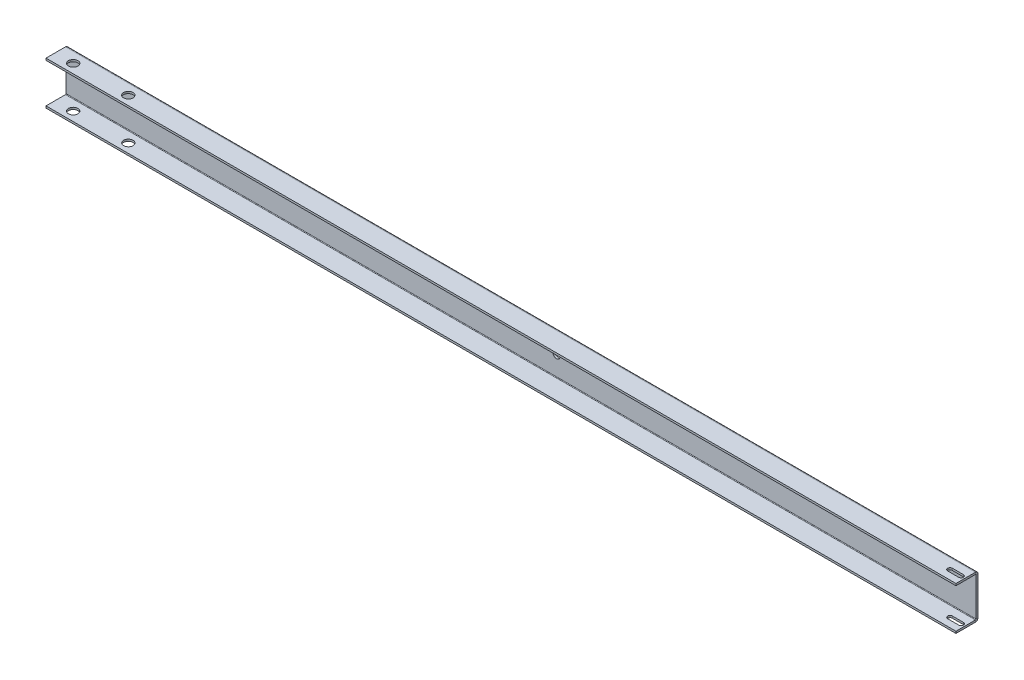
ISO-10303-21;
HEADER;
FILE_DESCRIPTION(('STEP AP214'),'2;1');
FILE_NAME('part.step','',(''),(''),'','','');
FILE_SCHEMA(('AUTOMOTIVE_DESIGN { 1 0 10303 214 1 1 1 1 }'));
ENDSEC;
DATA;
#1=APPLICATION_CONTEXT('core data for automotive mechanical design processes');
#2=APPLICATION_PROTOCOL_DEFINITION('international standard','automotive_design',2000,#1);
#3=PRODUCT_CONTEXT('',#1,'mechanical');
#4=PRODUCT('Part','Part','',(#3));
#5=PRODUCT_RELATED_PRODUCT_CATEGORY('part','',(#4));
#6=PRODUCT_DEFINITION_FORMATION('','',#4);
#7=PRODUCT_DEFINITION_CONTEXT('part definition',#1,'design');
#8=PRODUCT_DEFINITION('design','',#6,#7);
#9=PRODUCT_DEFINITION_SHAPE('','',#8);
#10=(LENGTH_UNIT() NAMED_UNIT(*) SI_UNIT(.MILLI.,.METRE.));
#11=(NAMED_UNIT(*) PLANE_ANGLE_UNIT() SI_UNIT($,.RADIAN.));
#12=(NAMED_UNIT(*) SI_UNIT($,.STERADIAN.) SOLID_ANGLE_UNIT());
#13=UNCERTAINTY_MEASURE_WITH_UNIT(LENGTH_MEASURE(1.E-05),#10,'distance_accuracy_value','');
#14=(GEOMETRIC_REPRESENTATION_CONTEXT(3) GLOBAL_UNCERTAINTY_ASSIGNED_CONTEXT((#13)) GLOBAL_UNIT_ASSIGNED_CONTEXT((#10,
#11,#12)) REPRESENTATION_CONTEXT('',''));
#15=CARTESIAN_POINT('',(0.,0.,0.));
#16=DIRECTION('',(0.,0.,1.));
#17=DIRECTION('',(1.,0.,0.));
#18=AXIS2_PLACEMENT_3D('',#15,#16,#17);
#19=CARTESIAN_POINT('',(0.,0.,-2.5));
#20=DIRECTION('',(0.,0.,-1.));
#21=DIRECTION('',(-1.,0.,0.));
#22=AXIS2_PLACEMENT_3D('',#19,#20,#21);
#23=PLANE('',#22);
#24=CARTESIAN_POINT('',(44.9385000000003,0.,-2.5));
#25=DIRECTION('',(0.,0.,-1.));
#26=DIRECTION('',(-1.,0.,0.));
#27=AXIS2_PLACEMENT_3D('',#24,#25,#26);
#28=CIRCLE('',#27,4.50000000000002);
#29=CARTESIAN_POINT('',(40.4385000000003,0.,-2.5));
#30=VERTEX_POINT('',#29);
#31=EDGE_CURVE('E882',#30,#30,#28,.T.);
#32=ORIENTED_EDGE('',*,*,#31,.F.);
#33=EDGE_LOOP('',(#32));
#34=FACE_BOUND('',#33,.T.);
#35=DIRECTION('',(0.,1.,0.));
#36=VECTOR('',#35,1.);
#37=CARTESIAN_POINT('',(577.5,-27.5,-2.5));
#38=LINE('',#37,#36);
#39=CARTESIAN_POINT('',(577.5,-24.2634,-2.49999999999998));
#40=VERTEX_POINT('',#39);
#41=CARTESIAN_POINT('',(577.5,24.2634,-2.5));
#42=VERTEX_POINT('',#41);
#43=EDGE_CURVE('E237',#40,#42,#38,.T.);
#44=ORIENTED_EDGE('',*,*,#43,.F.);
#45=DIRECTION('',(1.,0.,0.));
#46=VECTOR('',#45,1.);
#47=CARTESIAN_POINT('',(577.5,-24.2634,-2.49999999999998));
#48=LINE('',#47,#46);
#49=CARTESIAN_POINT('',(-577.5,-24.2634,-2.5));
#50=VERTEX_POINT('',#49);
#51=EDGE_CURVE('E327',#40,#50,#48,.F.);
#52=ORIENTED_EDGE('',*,*,#51,.T.);
#53=DIRECTION('',(0.,-1.,0.));
#54=VECTOR('',#53,1.);
#55=CARTESIAN_POINT('',(-577.5,-27.5,-2.5));
#56=LINE('',#55,#54);
#57=CARTESIAN_POINT('',(-577.5,24.2634,-2.50000000000001));
#58=VERTEX_POINT('',#57);
#59=EDGE_CURVE('E233',#58,#50,#56,.T.);
#60=ORIENTED_EDGE('',*,*,#59,.F.);
#61=DIRECTION('',(-1.,0.,0.));
#62=VECTOR('',#61,1.);
#63=CARTESIAN_POINT('',(-577.5,24.2634,-2.50000000000001));
#64=LINE('',#63,#62);
#65=EDGE_CURVE('E380',#58,#42,#64,.F.);
#66=ORIENTED_EDGE('',*,*,#65,.T.);
#67=EDGE_LOOP('',(#44,#52,#60,#66));
#68=FACE_BOUND('',#67,.T.);
#69=ADVANCED_FACE('F76',(#34,#68),#23,.T.);
#70=CARTESIAN_POINT('',(0.,0.,0.));
#71=DIRECTION('',(0.,0.,-1.));
#72=DIRECTION('',(-1.,0.,0.));
#73=AXIS2_PLACEMENT_3D('',#70,#71,#72);
#74=PLANE('',#73);
#75=CARTESIAN_POINT('',(44.9385000000003,0.,0.));
#76=DIRECTION('',(0.,0.,1.));
#77=DIRECTION('',(1.,0.,0.));
#78=AXIS2_PLACEMENT_3D('',#75,#76,#77);
#79=CIRCLE('',#78,4.50000000000002);
#80=CARTESIAN_POINT('',(49.4385000000003,0.,0.));
#81=VERTEX_POINT('',#80);
#82=EDGE_CURVE('E885',#81,#81,#79,.T.);
#83=ORIENTED_EDGE('',*,*,#82,.F.);
#84=EDGE_LOOP('',(#83));
#85=FACE_BOUND('',#84,.T.);
#86=DIRECTION('',(1.,0.,0.));
#87=VECTOR('',#86,1.);
#88=CARTESIAN_POINT('',(577.5,-24.2634,0.));
#89=LINE('',#88,#87);
#90=CARTESIAN_POINT('',(577.5,-24.2634,0.));
#91=VERTEX_POINT('',#90);
#92=CARTESIAN_POINT('',(-577.5,-24.2634,0.));
#93=VERTEX_POINT('',#92);
#94=EDGE_CURVE('E340',#91,#93,#89,.F.);
#95=ORIENTED_EDGE('',*,*,#94,.F.);
#96=DIRECTION('',(0.,1.,0.));
#97=VECTOR('',#96,1.);
#98=CARTESIAN_POINT('',(577.5,-27.5,0.));
#99=LINE('',#98,#97);
#100=CARTESIAN_POINT('',(577.5,24.2634,0.));
#101=VERTEX_POINT('',#100);
#102=EDGE_CURVE('E400',#91,#101,#99,.T.);
#103=ORIENTED_EDGE('',*,*,#102,.T.);
#104=DIRECTION('',(-1.,0.,0.));
#105=VECTOR('',#104,1.);
#106=CARTESIAN_POINT('',(-577.5,24.2634,0.));
#107=LINE('',#106,#105);
#108=CARTESIAN_POINT('',(-577.5,24.2634,0.));
#109=VERTEX_POINT('',#108);
#110=EDGE_CURVE('E393',#109,#101,#107,.F.);
#111=ORIENTED_EDGE('',*,*,#110,.F.);
#112=DIRECTION('',(0.,-1.,0.));
#113=VECTOR('',#112,1.);
#114=CARTESIAN_POINT('',(-577.5,-27.5,0.));
#115=LINE('',#114,#113);
#116=EDGE_CURVE('E240',#109,#93,#115,.T.);
#117=ORIENTED_EDGE('',*,*,#116,.T.);
#118=EDGE_LOOP('',(#95,#103,#111,#117));
#119=FACE_BOUND('',#118,.T.);
#120=ADVANCED_FACE('F412',(#85,#119),#74,.F.);
#121=CARTESIAN_POINT('',(577.5,-27.5,-2.5));
#122=DIRECTION('',(1.,0.,0.));
#123=DIRECTION('',(0.,0.,-1.));
#124=AXIS2_PLACEMENT_3D('',#121,#122,#123);
#125=PLANE('',#124);
#126=ORIENTED_EDGE('',*,*,#102,.F.);
#127=DIRECTION('',(0.,0.,-1.));
#128=VECTOR('',#127,1.);
#129=CARTESIAN_POINT('',(577.5,-24.2634,0.));
#130=LINE('',#129,#128);
#131=EDGE_CURVE('E334',#91,#40,#130,.T.);
#132=ORIENTED_EDGE('',*,*,#131,.T.);
#133=ORIENTED_EDGE('',*,*,#43,.T.);
#134=DIRECTION('',(0.,0.,-1.));
#135=VECTOR('',#134,1.);
#136=CARTESIAN_POINT('',(577.5,24.2634,0.));
#137=LINE('',#136,#135);
#138=EDGE_CURVE('E397',#101,#42,#137,.T.);
#139=ORIENTED_EDGE('',*,*,#138,.F.);
#140=EDGE_LOOP('',(#126,#132,#133,#139));
#141=FACE_BOUND('',#140,.T.);
#142=ADVANCED_FACE('F78',(#141),#125,.T.);
#143=CARTESIAN_POINT('',(-577.5,-27.5,-2.5));
#144=DIRECTION('',(-1.,0.,0.));
#145=DIRECTION('',(0.,0.,1.));
#146=AXIS2_PLACEMENT_3D('',#143,#144,#145);
#147=PLANE('',#146);
#148=DIRECTION('',(0.,0.,-1.));
#149=VECTOR('',#148,1.);
#150=CARTESIAN_POINT('',(-577.5,-24.2634,0.));
#151=LINE('',#150,#149);
#152=EDGE_CURVE('E344',#93,#50,#151,.T.);
#153=ORIENTED_EDGE('',*,*,#152,.F.);
#154=ORIENTED_EDGE('',*,*,#116,.F.);
#155=DIRECTION('',(0.,0.,-1.));
#156=VECTOR('',#155,1.);
#157=CARTESIAN_POINT('',(-577.5,24.2634,0.));
#158=LINE('',#157,#156);
#159=EDGE_CURVE('E387',#109,#58,#158,.T.);
#160=ORIENTED_EDGE('',*,*,#159,.T.);
#161=ORIENTED_EDGE('',*,*,#59,.T.);
#162=EDGE_LOOP('',(#153,#154,#160,#161));
#163=FACE_BOUND('',#162,.T.);
#164=ADVANCED_FACE('F415',(#163),#147,.T.);
#165=CARTESIAN_POINT('',(577.5,24.2634,0.736599999999994));
#166=DIRECTION('',(1.,0.,0.));
#167=DIRECTION('',(0.,0.,-1.));
#168=AXIS2_PLACEMENT_3D('',#165,#166,#167);
#169=PLANE('',#168);
#170=DIRECTION('',(0.,-1.,0.));
#171=VECTOR('',#170,1.);
#172=CARTESIAN_POINT('',(577.5,27.5,0.736599999999988));
#173=LINE('',#172,#171);
#174=CARTESIAN_POINT('',(577.5,25.,0.736599999999992));
#175=VERTEX_POINT('',#174);
#176=CARTESIAN_POINT('',(577.5,27.5,0.736599999999983));
#177=VERTEX_POINT('',#176);
#178=EDGE_CURVE('E347',#175,#177,#173,.F.);
#179=ORIENTED_EDGE('',*,*,#178,.F.);
#180=CARTESIAN_POINT('',(577.5,24.2634,0.736599999999994));
#181=DIRECTION('',(-1.,0.,0.));
#182=DIRECTION('',(0.,0.,1.));
#183=AXIS2_PLACEMENT_3D('',#180,#181,#182);
#184=CIRCLE('',#183,0.7366);
#185=EDGE_CURVE('E390',#101,#175,#184,.F.);
#186=ORIENTED_EDGE('',*,*,#185,.F.);
#187=ORIENTED_EDGE('',*,*,#138,.T.);
#188=CARTESIAN_POINT('',(577.5,24.2634,0.736599999999994));
#189=DIRECTION('',(-1.,0.,0.));
#190=DIRECTION('',(0.,0.,1.));
#191=AXIS2_PLACEMENT_3D('',#188,#189,#190);
#192=CIRCLE('',#191,3.2366);
#193=EDGE_CURVE('E383',#42,#177,#192,.F.);
#194=ORIENTED_EDGE('',*,*,#193,.T.);
#195=EDGE_LOOP('',(#179,#186,#187,#194));
#196=FACE_BOUND('',#195,.T.);
#197=ADVANCED_FACE('F432',(#196),#169,.T.);
#198=CARTESIAN_POINT('',(-577.5,24.2634,0.736599999999994));
#199=DIRECTION('',(1.,0.,0.));
#200=DIRECTION('',(0.,0.,-1.));
#201=AXIS2_PLACEMENT_3D('',#198,#199,#200);
#202=PLANE('',#201);
#203=CARTESIAN_POINT('',(-577.5,24.2634,0.736599999999994));
#204=DIRECTION('',(-1.,0.,0.));
#205=DIRECTION('',(0.,0.,1.));
#206=AXIS2_PLACEMENT_3D('',#203,#204,#205);
#207=CIRCLE('',#206,0.7366);
#208=CARTESIAN_POINT('',(-577.5,25.,0.736599999999992));
#209=VERTEX_POINT('',#208);
#210=EDGE_CURVE('E353',#209,#109,#207,.T.);
#211=ORIENTED_EDGE('',*,*,#210,.F.);
#212=DIRECTION('',(0.,-1.,0.));
#213=VECTOR('',#212,1.);
#214=CARTESIAN_POINT('',(-577.5,25.,0.736599999999987));
#215=LINE('',#214,#213);
#216=CARTESIAN_POINT('',(-577.5,27.5,0.736599999999978));
#217=VERTEX_POINT('',#216);
#218=EDGE_CURVE('E373',#209,#217,#215,.F.);
#219=ORIENTED_EDGE('',*,*,#218,.T.);
#220=CARTESIAN_POINT('',(-577.5,24.2634,0.736599999999994));
#221=DIRECTION('',(-1.,0.,0.));
#222=DIRECTION('',(0.,0.,1.));
#223=AXIS2_PLACEMENT_3D('',#220,#221,#222);
#224=CIRCLE('',#223,3.2366);
#225=EDGE_CURVE('E384',#217,#58,#224,.T.);
#226=ORIENTED_EDGE('',*,*,#225,.T.);
#227=ORIENTED_EDGE('',*,*,#159,.F.);
#228=EDGE_LOOP('',(#211,#219,#226,#227));
#229=FACE_BOUND('',#228,.T.);
#230=ADVANCED_FACE('F456',(#229),#202,.F.);
#231=CARTESIAN_POINT('',(-577.5,24.2634,0.736599999999994));
#232=DIRECTION('',(-1.,0.,0.));
#233=DIRECTION('',(0.,1.,0.));
#234=AXIS2_PLACEMENT_3D('',#231,#232,#233);
#235=CYLINDRICAL_SURFACE('',#234,3.2366);
#236=ORIENTED_EDGE('',*,*,#65,.F.);
#237=ORIENTED_EDGE('',*,*,#225,.F.);
#238=DIRECTION('',(-1.,0.,0.));
#239=VECTOR('',#238,1.);
#240=CARTESIAN_POINT('',(577.5,27.5,0.736599999999988));
#241=LINE('',#240,#239);
#242=EDGE_CURVE('E371',#217,#177,#241,.F.);
#243=ORIENTED_EDGE('',*,*,#242,.T.);
#244=ORIENTED_EDGE('',*,*,#193,.F.);
#245=EDGE_LOOP('',(#236,#237,#243,#244));
#246=FACE_BOUND('',#245,.T.);
#247=ADVANCED_FACE('F460',(#246),#235,.T.);
#248=CARTESIAN_POINT('',(-577.5,24.2634,0.736599999999994));
#249=DIRECTION('',(-1.,0.,0.));
#250=DIRECTION('',(0.,1.,0.));
#251=AXIS2_PLACEMENT_3D('',#248,#249,#250);
#252=CYLINDRICAL_SURFACE('',#251,0.7366);
#253=ORIENTED_EDGE('',*,*,#110,.T.);
#254=ORIENTED_EDGE('',*,*,#185,.T.);
#255=DIRECTION('',(-1.,0.,0.));
#256=VECTOR('',#255,1.);
#257=CARTESIAN_POINT('',(577.5,25.,0.736599999999997));
#258=LINE('',#257,#256);
#259=EDGE_CURVE('E376',#175,#209,#258,.T.);
#260=ORIENTED_EDGE('',*,*,#259,.T.);
#261=ORIENTED_EDGE('',*,*,#210,.T.);
#262=EDGE_LOOP('',(#253,#254,#260,#261));
#263=FACE_BOUND('',#262,.T.);
#264=ADVANCED_FACE('F435',(#263),#252,.F.);
#265=CARTESIAN_POINT('',(577.5,27.5,0.));
#266=DIRECTION('',(-1.,0.,0.));
#267=DIRECTION('',(0.,0.,1.));
#268=AXIS2_PLACEMENT_3D('',#265,#266,#267);
#269=PLANE('',#268);
#270=ORIENTED_EDGE('',*,*,#178,.T.);
#271=DIRECTION('',(0.,0.,-1.));
#272=VECTOR('',#271,1.);
#273=CARTESIAN_POINT('',(577.5,27.5,-1.06009274745023E-13));
#274=LINE('',#273,#272);
#275=CARTESIAN_POINT('',(577.5,27.5000000000001,25.5));
#276=VERTEX_POINT('',#275);
#277=EDGE_CURVE('E361',#276,#177,#274,.T.);
#278=ORIENTED_EDGE('',*,*,#277,.F.);
#279=DIRECTION('',(0.,-1.,0.));
#280=VECTOR('',#279,1.);
#281=CARTESIAN_POINT('',(577.5,27.5000000000001,25.5));
#282=LINE('',#281,#280);
#283=CARTESIAN_POINT('',(577.5,25.0000000000001,25.5));
#284=VERTEX_POINT('',#283);
#285=EDGE_CURVE('E354',#276,#284,#282,.T.);
#286=ORIENTED_EDGE('',*,*,#285,.T.);
#287=DIRECTION('',(0.,0.,1.));
#288=VECTOR('',#287,1.);
#289=CARTESIAN_POINT('',(577.5,25.,0.));
#290=LINE('',#289,#288);
#291=EDGE_CURVE('E368',#284,#175,#290,.F.);
#292=ORIENTED_EDGE('',*,*,#291,.T.);
#293=EDGE_LOOP('',(#270,#278,#286,#292));
#294=FACE_BOUND('',#293,.T.);
#295=ADVANCED_FACE('F443',(#294),#269,.F.);
#296=CARTESIAN_POINT('',(-577.5,27.5000000000001,25.5));
#297=DIRECTION('',(1.,0.,0.));
#298=DIRECTION('',(0.,0.,-1.));
#299=AXIS2_PLACEMENT_3D('',#296,#297,#298);
#300=PLANE('',#299);
#301=ORIENTED_EDGE('',*,*,#218,.F.);
#302=DIRECTION('',(0.,0.,-1.));
#303=VECTOR('',#302,1.);
#304=CARTESIAN_POINT('',(-577.5,25.0000000000001,25.5));
#305=LINE('',#304,#303);
#306=CARTESIAN_POINT('',(-577.5,25.0000000000001,25.5));
#307=VERTEX_POINT('',#306);
#308=EDGE_CURVE('E366',#209,#307,#305,.F.);
#309=ORIENTED_EDGE('',*,*,#308,.T.);
#310=DIRECTION('',(0.,-1.,0.));
#311=VECTOR('',#310,1.);
#312=CARTESIAN_POINT('',(-577.5,27.5000000000001,25.5));
#313=LINE('',#312,#311);
#314=CARTESIAN_POINT('',(-577.5,27.5000000000001,25.5));
#315=VERTEX_POINT('',#314);
#316=EDGE_CURVE('E350',#315,#307,#313,.T.);
#317=ORIENTED_EDGE('',*,*,#316,.F.);
#318=DIRECTION('',(0.,0.,1.));
#319=VECTOR('',#318,1.);
#320=CARTESIAN_POINT('',(-577.5,27.5,-1.06009274745023E-13));
#321=LINE('',#320,#319);
#322=EDGE_CURVE('E359',#217,#315,#321,.T.);
#323=ORIENTED_EDGE('',*,*,#322,.F.);
#324=EDGE_LOOP('',(#301,#309,#317,#323));
#325=FACE_BOUND('',#324,.T.);
#326=ADVANCED_FACE('F453',(#325),#300,.F.);
#327=CARTESIAN_POINT('',(0.,27.5,-1.06009274745023E-13));
#328=DIRECTION('',(0.,-1.,0.));
#329=DIRECTION('',(0.,0.,-1.));
#330=AXIS2_PLACEMENT_3D('',#327,#328,#329);
#331=PLANE('',#330);
#332=CARTESIAN_POINT('',(-484.5,27.5,14.));
#333=DIRECTION('',(0.,-1.,0.));
#334=DIRECTION('',(0.,0.,-1.));
#335=AXIS2_PLACEMENT_3D('',#332,#333,#334);
#336=CIRCLE('',#335,5.99999999999999);
#337=CARTESIAN_POINT('',(-484.5,27.5,8.00000000000001));
#338=VERTEX_POINT('',#337);
#339=EDGE_CURVE('E264',#338,#338,#336,.T.);
#340=ORIENTED_EDGE('',*,*,#339,.T.);
#341=EDGE_LOOP('',(#340));
#342=FACE_BOUND('',#341,.T.);
#343=CARTESIAN_POINT('',(-554.5,27.5,14.));
#344=DIRECTION('',(0.,-1.,0.));
#345=DIRECTION('',(0.,0.,-1.));
#346=AXIS2_PLACEMENT_3D('',#343,#344,#345);
#347=CIRCLE('',#346,5.99999999999999);
#348=CARTESIAN_POINT('',(-554.5,27.5,8.00000000000001));
#349=VERTEX_POINT('',#348);
#350=EDGE_CURVE('E261',#349,#349,#347,.T.);
#351=ORIENTED_EDGE('',*,*,#350,.T.);
#352=EDGE_LOOP('',(#351));
#353=FACE_BOUND('',#352,.T.);
#354=DIRECTION('',(1.,0.,0.));
#355=VECTOR('',#354,1.);
#356=CARTESIAN_POINT('',(572.5,27.5,11.));
#357=LINE('',#356,#355);
#358=CARTESIAN_POINT('',(572.5,27.5,11.));
#359=VERTEX_POINT('',#358);
#360=CARTESIAN_POINT('',(558.5,27.5,11.));
#361=VERTEX_POINT('',#360);
#362=EDGE_CURVE('E244',#359,#361,#357,.F.);
#363=ORIENTED_EDGE('',*,*,#362,.F.);
#364=CARTESIAN_POINT('',(572.5,27.5,14.));
#365=DIRECTION('',(0.,1.,0.));
#366=DIRECTION('',(0.,0.,1.));
#367=AXIS2_PLACEMENT_3D('',#364,#365,#366);
#368=CIRCLE('',#367,3.);
#369=CARTESIAN_POINT('',(572.5,27.5,17.));
#370=VERTEX_POINT('',#369);
#371=EDGE_CURVE('E252',#370,#359,#368,.T.);
#372=ORIENTED_EDGE('',*,*,#371,.F.);
#373=DIRECTION('',(1.,0.,0.));
#374=VECTOR('',#373,1.);
#375=CARTESIAN_POINT('',(572.5,27.5,17.));
#376=LINE('',#375,#374);
#377=CARTESIAN_POINT('',(558.5,27.5,17.));
#378=VERTEX_POINT('',#377);
#379=EDGE_CURVE('E122',#378,#370,#376,.T.);
#380=ORIENTED_EDGE('',*,*,#379,.F.);
#381=CARTESIAN_POINT('',(558.5,27.5,14.));
#382=DIRECTION('',(0.,1.,0.));
#383=DIRECTION('',(0.,0.,1.));
#384=AXIS2_PLACEMENT_3D('',#381,#382,#383);
#385=CIRCLE('',#384,2.99999999999999);
#386=EDGE_CURVE('E248',#361,#378,#385,.T.);
#387=ORIENTED_EDGE('',*,*,#386,.F.);
#388=EDGE_LOOP('',(#363,#372,#380,#387));
#389=FACE_BOUND('',#388,.T.);
#390=ORIENTED_EDGE('',*,*,#242,.F.);
#391=ORIENTED_EDGE('',*,*,#322,.T.);
#392=DIRECTION('',(1.,0.,0.));
#393=VECTOR('',#392,1.);
#394=CARTESIAN_POINT('',(0.,27.5000000000001,25.5));
#395=LINE('',#394,#393);
#396=EDGE_CURVE('E357',#315,#276,#395,.T.);
#397=ORIENTED_EDGE('',*,*,#396,.T.);
#398=ORIENTED_EDGE('',*,*,#277,.T.);
#399=EDGE_LOOP('',(#390,#391,#397,#398));
#400=FACE_BOUND('',#399,.T.);
#401=ADVANCED_FACE('F458',(#342,#353,#389,#400),#331,.F.);
#402=CARTESIAN_POINT('',(0.,25.,0.));
#403=DIRECTION('',(0.,-1.,0.));
#404=DIRECTION('',(0.,0.,-1.));
#405=AXIS2_PLACEMENT_3D('',#402,#403,#404);
#406=PLANE('',#405);
#407=CARTESIAN_POINT('',(-484.5,25.,14.));
#408=DIRECTION('',(0.,-1.,0.));
#409=DIRECTION('',(0.,0.,-1.));
#410=AXIS2_PLACEMENT_3D('',#407,#408,#409);
#411=CIRCLE('',#410,5.99999999999999);
#412=CARTESIAN_POINT('',(-484.5,25.,8.00000000000002));
#413=VERTEX_POINT('',#412);
#414=EDGE_CURVE('E269',#413,#413,#411,.T.);
#415=ORIENTED_EDGE('',*,*,#414,.F.);
#416=EDGE_LOOP('',(#415));
#417=FACE_BOUND('',#416,.T.);
#418=CARTESIAN_POINT('',(-554.5,25.,14.));
#419=DIRECTION('',(0.,-1.,0.));
#420=DIRECTION('',(0.,0.,-1.));
#421=AXIS2_PLACEMENT_3D('',#418,#419,#420);
#422=CIRCLE('',#421,5.99999999999999);
#423=CARTESIAN_POINT('',(-554.5,25.,8.00000000000002));
#424=VERTEX_POINT('',#423);
#425=EDGE_CURVE('E256',#424,#424,#422,.T.);
#426=ORIENTED_EDGE('',*,*,#425,.F.);
#427=EDGE_LOOP('',(#426));
#428=FACE_BOUND('',#427,.T.);
#429=CARTESIAN_POINT('',(572.5,25.,14.));
#430=DIRECTION('',(0.,-1.,0.));
#431=DIRECTION('',(0.,0.,-1.));
#432=AXIS2_PLACEMENT_3D('',#429,#430,#431);
#433=CIRCLE('',#432,3.);
#434=CARTESIAN_POINT('',(572.5,25.,11.));
#435=VERTEX_POINT('',#434);
#436=CARTESIAN_POINT('',(572.5,25.,17.));
#437=VERTEX_POINT('',#436);
#438=EDGE_CURVE('E131',#435,#437,#433,.T.);
#439=ORIENTED_EDGE('',*,*,#438,.F.);
#440=DIRECTION('',(1.,0.,0.));
#441=VECTOR('',#440,1.);
#442=CARTESIAN_POINT('',(0.,25.,11.0000000000002));
#443=LINE('',#442,#441);
#444=CARTESIAN_POINT('',(558.5,25.,11.));
#445=VERTEX_POINT('',#444);
#446=EDGE_CURVE('E247',#445,#435,#443,.T.);
#447=ORIENTED_EDGE('',*,*,#446,.F.);
#448=CARTESIAN_POINT('',(558.5,25.,14.));
#449=DIRECTION('',(0.,-1.,0.));
#450=DIRECTION('',(0.,0.,-1.));
#451=AXIS2_PLACEMENT_3D('',#448,#449,#450);
#452=CIRCLE('',#451,2.99999999999999);
#453=CARTESIAN_POINT('',(558.5,25.,17.));
#454=VERTEX_POINT('',#453);
#455=EDGE_CURVE('E246',#454,#445,#452,.T.);
#456=ORIENTED_EDGE('',*,*,#455,.F.);
#457=DIRECTION('',(-1.,0.,0.));
#458=VECTOR('',#457,1.);
#459=CARTESIAN_POINT('',(0.,25.,17.));
#460=LINE('',#459,#458);
#461=EDGE_CURVE('E250',#437,#454,#460,.T.);
#462=ORIENTED_EDGE('',*,*,#461,.F.);
#463=EDGE_LOOP('',(#439,#447,#456,#462));
#464=FACE_BOUND('',#463,.T.);
#465=ORIENTED_EDGE('',*,*,#308,.F.);
#466=ORIENTED_EDGE('',*,*,#259,.F.);
#467=ORIENTED_EDGE('',*,*,#291,.F.);
#468=DIRECTION('',(-1.,0.,0.));
#469=VECTOR('',#468,1.);
#470=CARTESIAN_POINT('',(577.5,25.0000000000001,25.5));
#471=LINE('',#470,#469);
#472=EDGE_CURVE('E364',#307,#284,#471,.F.);
#473=ORIENTED_EDGE('',*,*,#472,.F.);
#474=EDGE_LOOP('',(#465,#466,#467,#473));
#475=FACE_BOUND('',#474,.T.);
#476=ADVANCED_FACE('F440',(#417,#428,#464,#475),#406,.T.);
#477=CARTESIAN_POINT('',(577.5,27.5000000000001,25.5));
#478=DIRECTION('',(0.,0.,-1.));
#479=DIRECTION('',(0.,1.,0.));
#480=AXIS2_PLACEMENT_3D('',#477,#478,#479);
#481=PLANE('',#480);
#482=ORIENTED_EDGE('',*,*,#472,.T.);
#483=ORIENTED_EDGE('',*,*,#285,.F.);
#484=ORIENTED_EDGE('',*,*,#396,.F.);
#485=ORIENTED_EDGE('',*,*,#316,.T.);
#486=EDGE_LOOP('',(#482,#483,#484,#485));
#487=FACE_BOUND('',#486,.T.);
#488=ADVANCED_FACE('F448',(#487),#481,.F.);
#489=CARTESIAN_POINT('',(-577.5,-24.2634,0.736600000000017));
#490=DIRECTION('',(-1.,0.,0.));
#491=DIRECTION('',(0.,0.,1.));
#492=AXIS2_PLACEMENT_3D('',#489,#490,#491);
#493=PLANE('',#492);
#494=DIRECTION('',(0.,1.,0.));
#495=VECTOR('',#494,1.);
#496=CARTESIAN_POINT('',(-577.5,-27.5,0.736599999999988));
#497=LINE('',#496,#495);
#498=CARTESIAN_POINT('',(-577.5,-25.,0.736600000000014));
#499=VERTEX_POINT('',#498);
#500=CARTESIAN_POINT('',(-577.5,-27.5,0.736600000000005));
#501=VERTEX_POINT('',#500);
#502=EDGE_CURVE('E253',#499,#501,#497,.F.);
#503=ORIENTED_EDGE('',*,*,#502,.F.);
#504=CARTESIAN_POINT('',(-577.5,-24.2634,0.736600000000017));
#505=DIRECTION('',(1.,0.,0.));
#506=DIRECTION('',(0.,0.,-1.));
#507=AXIS2_PLACEMENT_3D('',#504,#505,#506);
#508=CIRCLE('',#507,0.7366);
#509=EDGE_CURVE('E337',#93,#499,#508,.F.);
#510=ORIENTED_EDGE('',*,*,#509,.F.);
#511=ORIENTED_EDGE('',*,*,#152,.T.);
#512=CARTESIAN_POINT('',(-577.5,-24.2634,0.736600000000017));
#513=DIRECTION('',(1.,0.,0.));
#514=DIRECTION('',(0.,0.,-1.));
#515=AXIS2_PLACEMENT_3D('',#512,#513,#514);
#516=CIRCLE('',#515,3.2366);
#517=EDGE_CURVE('E330',#50,#501,#516,.F.);
#518=ORIENTED_EDGE('',*,*,#517,.T.);
#519=EDGE_LOOP('',(#503,#510,#511,#518));
#520=FACE_BOUND('',#519,.T.);
#521=ADVANCED_FACE('F419',(#520),#493,.T.);
#522=CARTESIAN_POINT('',(577.5,-24.2634,0.736600000000017));
#523=DIRECTION('',(-1.,0.,0.));
#524=DIRECTION('',(0.,0.,1.));
#525=AXIS2_PLACEMENT_3D('',#522,#523,#524);
#526=PLANE('',#525);
#527=CARTESIAN_POINT('',(577.5,-24.2634,0.736600000000017));
#528=DIRECTION('',(1.,0.,0.));
#529=DIRECTION('',(0.,0.,-1.));
#530=AXIS2_PLACEMENT_3D('',#527,#528,#529);
#531=CIRCLE('',#530,0.7366);
#532=CARTESIAN_POINT('',(577.5,-25.,0.736600000000014));
#533=VERTEX_POINT('',#532);
#534=EDGE_CURVE('E300',#533,#91,#531,.T.);
#535=ORIENTED_EDGE('',*,*,#534,.F.);
#536=DIRECTION('',(0.,1.,0.));
#537=VECTOR('',#536,1.);
#538=CARTESIAN_POINT('',(577.5,-25.,0.736600000000032));
#539=LINE('',#538,#537);
#540=CARTESIAN_POINT('',(577.5,-27.5,0.736600000000023));
#541=VERTEX_POINT('',#540);
#542=EDGE_CURVE('E320',#533,#541,#539,.F.);
#543=ORIENTED_EDGE('',*,*,#542,.T.);
#544=CARTESIAN_POINT('',(577.5,-24.2634,0.736600000000017));
#545=DIRECTION('',(1.,0.,0.));
#546=DIRECTION('',(0.,0.,-1.));
#547=AXIS2_PLACEMENT_3D('',#544,#545,#546);
#548=CIRCLE('',#547,3.2366);
#549=EDGE_CURVE('E331',#541,#40,#548,.T.);
#550=ORIENTED_EDGE('',*,*,#549,.T.);
#551=ORIENTED_EDGE('',*,*,#131,.F.);
#552=EDGE_LOOP('',(#535,#543,#550,#551));
#553=FACE_BOUND('',#552,.T.);
#554=ADVANCED_FACE('F426',(#553),#526,.F.);
#555=CARTESIAN_POINT('',(577.5,-24.2634,0.736600000000017));
#556=DIRECTION('',(1.,0.,0.));
#557=DIRECTION('',(0.,-1.,0.));
#558=AXIS2_PLACEMENT_3D('',#555,#556,#557);
#559=CYLINDRICAL_SURFACE('',#558,3.2366);
#560=ORIENTED_EDGE('',*,*,#51,.F.);
#561=ORIENTED_EDGE('',*,*,#549,.F.);
#562=DIRECTION('',(1.,0.,0.));
#563=VECTOR('',#562,1.);
#564=CARTESIAN_POINT('',(-577.5,-27.5,0.736599999999988));
#565=LINE('',#564,#563);
#566=EDGE_CURVE('E318',#541,#501,#565,.F.);
#567=ORIENTED_EDGE('',*,*,#566,.T.);
#568=ORIENTED_EDGE('',*,*,#517,.F.);
#569=EDGE_LOOP('',(#560,#561,#567,#568));
#570=FACE_BOUND('',#569,.T.);
#571=ADVANCED_FACE('F423',(#570),#559,.T.);
#572=CARTESIAN_POINT('',(577.5,-24.2634,0.736600000000017));
#573=DIRECTION('',(1.,0.,0.));
#574=DIRECTION('',(0.,-1.,0.));
#575=AXIS2_PLACEMENT_3D('',#572,#573,#574);
#576=CYLINDRICAL_SURFACE('',#575,0.7366);
#577=ORIENTED_EDGE('',*,*,#94,.T.);
#578=ORIENTED_EDGE('',*,*,#509,.T.);
#579=DIRECTION('',(1.,0.,0.));
#580=VECTOR('',#579,1.);
#581=CARTESIAN_POINT('',(-577.5,-25.,0.736599999999997));
#582=LINE('',#581,#580);
#583=EDGE_CURVE('E323',#499,#533,#582,.T.);
#584=ORIENTED_EDGE('',*,*,#583,.T.);
#585=ORIENTED_EDGE('',*,*,#534,.T.);
#586=EDGE_LOOP('',(#577,#578,#584,#585));
#587=FACE_BOUND('',#586,.T.);
#588=ADVANCED_FACE('F630',(#587),#576,.F.);
#589=CARTESIAN_POINT('',(-577.5,-27.5,0.));
#590=DIRECTION('',(1.,0.,0.));
#591=DIRECTION('',(0.,0.,-1.));
#592=AXIS2_PLACEMENT_3D('',#589,#590,#591);
#593=PLANE('',#592);
#594=ORIENTED_EDGE('',*,*,#502,.T.);
#595=DIRECTION('',(0.,0.,-1.));
#596=VECTOR('',#595,1.);
#597=CARTESIAN_POINT('',(-577.5,-27.5,-1.06009274745023E-13));
#598=LINE('',#597,#596);
#599=CARTESIAN_POINT('',(-577.5,-27.5000000000001,25.5));
#600=VERTEX_POINT('',#599);
#601=EDGE_CURVE('E308',#600,#501,#598,.T.);
#602=ORIENTED_EDGE('',*,*,#601,.F.);
#603=DIRECTION('',(0.,1.,0.));
#604=VECTOR('',#603,1.);
#605=CARTESIAN_POINT('',(-577.5,-27.5000000000001,25.5));
#606=LINE('',#605,#604);
#607=CARTESIAN_POINT('',(-577.5,-25.0000000000001,25.5));
#608=VERTEX_POINT('',#607);
#609=EDGE_CURVE('E301',#600,#608,#606,.T.);
#610=ORIENTED_EDGE('',*,*,#609,.T.);
#611=DIRECTION('',(0.,0.,1.));
#612=VECTOR('',#611,1.);
#613=CARTESIAN_POINT('',(-577.5,-25.,0.));
#614=LINE('',#613,#612);
#615=EDGE_CURVE('E315',#608,#499,#614,.F.);
#616=ORIENTED_EDGE('',*,*,#615,.T.);
#617=EDGE_LOOP('',(#594,#602,#610,#616));
#618=FACE_BOUND('',#617,.T.);
#619=ADVANCED_FACE('F622',(#618),#593,.F.);
#620=CARTESIAN_POINT('',(577.5,-27.5000000000001,25.5));
#621=DIRECTION('',(-1.,0.,0.));
#622=DIRECTION('',(0.,0.,1.));
#623=AXIS2_PLACEMENT_3D('',#620,#621,#622);
#624=PLANE('',#623);
#625=ORIENTED_EDGE('',*,*,#542,.F.);
#626=DIRECTION('',(0.,0.,-1.));
#627=VECTOR('',#626,1.);
#628=CARTESIAN_POINT('',(577.5,-25.0000000000001,25.5));
#629=LINE('',#628,#627);
#630=CARTESIAN_POINT('',(577.5,-25.0000000000001,25.5));
#631=VERTEX_POINT('',#630);
#632=EDGE_CURVE('E313',#533,#631,#629,.F.);
#633=ORIENTED_EDGE('',*,*,#632,.T.);
#634=DIRECTION('',(0.,1.,0.));
#635=VECTOR('',#634,1.);
#636=CARTESIAN_POINT('',(577.5,-27.5000000000001,25.5));
#637=LINE('',#636,#635);
#638=CARTESIAN_POINT('',(577.5,-27.5000000000001,25.5));
#639=VERTEX_POINT('',#638);
#640=EDGE_CURVE('E297',#639,#631,#637,.T.);
#641=ORIENTED_EDGE('',*,*,#640,.F.);
#642=DIRECTION('',(0.,0.,1.));
#643=VECTOR('',#642,1.);
#644=CARTESIAN_POINT('',(577.5,-27.5,-1.06009274745023E-13));
#645=LINE('',#644,#643);
#646=EDGE_CURVE('E306',#541,#639,#645,.T.);
#647=ORIENTED_EDGE('',*,*,#646,.F.);
#648=EDGE_LOOP('',(#625,#633,#641,#647));
#649=FACE_BOUND('',#648,.T.);
#650=ADVANCED_FACE('F614',(#649),#624,.F.);
#651=CARTESIAN_POINT('',(0.,-27.5,-1.06009274745023E-13));
#652=DIRECTION('',(0.,1.,0.));
#653=DIRECTION('',(0.,0.,1.));
#654=AXIS2_PLACEMENT_3D('',#651,#652,#653);
#655=PLANE('',#654);
#656=CARTESIAN_POINT('',(-484.5,-27.5000000000002,14.0000000000002));
#657=DIRECTION('',(0.,1.,0.));
#658=DIRECTION('',(0.,0.,1.));
#659=AXIS2_PLACEMENT_3D('',#656,#657,#658);
#660=CIRCLE('',#659,5.99999999999999);
#661=CARTESIAN_POINT('',(-484.5,-27.5000000000002,20.0000000000002));
#662=VERTEX_POINT('',#661);
#663=EDGE_CURVE('E878',#662,#662,#660,.T.);
#664=ORIENTED_EDGE('',*,*,#663,.T.);
#665=EDGE_LOOP('',(#664));
#666=FACE_BOUND('',#665,.T.);
#667=CARTESIAN_POINT('',(-554.5,-27.5000000000002,14.0000000000002));
#668=DIRECTION('',(0.,1.,0.));
#669=DIRECTION('',(0.,0.,1.));
#670=AXIS2_PLACEMENT_3D('',#667,#668,#669);
#671=CIRCLE('',#670,5.99999999999999);
#672=CARTESIAN_POINT('',(-554.5,-27.5000000000002,20.0000000000002));
#673=VERTEX_POINT('',#672);
#674=EDGE_CURVE('E257',#673,#673,#671,.T.);
#675=ORIENTED_EDGE('',*,*,#674,.T.);
#676=EDGE_LOOP('',(#675));
#677=FACE_BOUND('',#676,.T.);
#678=DIRECTION('',(1.,0.,0.));
#679=VECTOR('',#678,1.);
#680=CARTESIAN_POINT('',(572.5,-27.5000000000001,17.0000000000002));
#681=LINE('',#680,#679);
#682=CARTESIAN_POINT('',(558.5,-27.5000000000001,17.0000000000002));
#683=VERTEX_POINT('',#682);
#684=CARTESIAN_POINT('',(572.5,-27.5000000000001,17.0000000000002));
#685=VERTEX_POINT('',#684);
#686=EDGE_CURVE('E281',#683,#685,#681,.T.);
#687=ORIENTED_EDGE('',*,*,#686,.T.);
#688=CARTESIAN_POINT('',(572.5,-27.5000000000001,14.0000000000002));
#689=DIRECTION('',(0.,1.,0.));
#690=DIRECTION('',(0.,0.,1.));
#691=AXIS2_PLACEMENT_3D('',#688,#689,#690);
#692=CIRCLE('',#691,3.);
#693=CARTESIAN_POINT('',(572.5,-27.5000000000002,11.0000000000002));
#694=VERTEX_POINT('',#693);
#695=EDGE_CURVE('E275',#685,#694,#692,.T.);
#696=ORIENTED_EDGE('',*,*,#695,.T.);
#697=DIRECTION('',(-1.,0.,0.));
#698=VECTOR('',#697,1.);
#699=CARTESIAN_POINT('',(572.5,-27.5000000000002,11.0000000000002));
#700=LINE('',#699,#698);
#701=CARTESIAN_POINT('',(558.5,-27.5,11.0000000000002));
#702=VERTEX_POINT('',#701);
#703=EDGE_CURVE('E216',#694,#702,#700,.T.);
#704=ORIENTED_EDGE('',*,*,#703,.T.);
#705=CARTESIAN_POINT('',(558.5,-27.5000000000001,14.0000000000002));
#706=DIRECTION('',(0.,1.,0.));
#707=DIRECTION('',(0.,0.,1.));
#708=AXIS2_PLACEMENT_3D('',#705,#706,#707);
#709=CIRCLE('',#708,2.99999999999999);
#710=EDGE_CURVE('E278',#702,#683,#709,.T.);
#711=ORIENTED_EDGE('',*,*,#710,.T.);
#712=EDGE_LOOP('',(#687,#696,#704,#711));
#713=FACE_BOUND('',#712,.T.);
#714=ORIENTED_EDGE('',*,*,#566,.F.);
#715=ORIENTED_EDGE('',*,*,#646,.T.);
#716=DIRECTION('',(-1.,0.,0.));
#717=VECTOR('',#716,1.);
#718=CARTESIAN_POINT('',(0.,-27.5000000000001,25.5));
#719=LINE('',#718,#717);
#720=EDGE_CURVE('E304',#639,#600,#719,.T.);
#721=ORIENTED_EDGE('',*,*,#720,.T.);
#722=ORIENTED_EDGE('',*,*,#601,.T.);
#723=EDGE_LOOP('',(#714,#715,#721,#722));
#724=FACE_BOUND('',#723,.T.);
#725=ADVANCED_FACE('F606',(#666,#677,#713,#724),#655,.F.);
#726=CARTESIAN_POINT('',(0.,-25.,0.));
#727=DIRECTION('',(0.,1.,0.));
#728=DIRECTION('',(0.,0.,1.));
#729=AXIS2_PLACEMENT_3D('',#726,#727,#728);
#730=PLANE('',#729);
#731=CARTESIAN_POINT('',(-484.5,-25.0000000000001,14.0000000000002));
#732=DIRECTION('',(0.,1.,0.));
#733=DIRECTION('',(0.,0.,1.));
#734=AXIS2_PLACEMENT_3D('',#731,#732,#733);
#735=CIRCLE('',#734,5.99999999999999);
#736=CARTESIAN_POINT('',(-484.5,-25.0000000000001,20.0000000000002));
#737=VERTEX_POINT('',#736);
#738=EDGE_CURVE('E80',#737,#737,#735,.T.);
#739=ORIENTED_EDGE('',*,*,#738,.F.);
#740=EDGE_LOOP('',(#739));
#741=FACE_BOUND('',#740,.T.);
#742=CARTESIAN_POINT('',(-554.5,-25.0000000000001,14.0000000000002));
#743=DIRECTION('',(0.,1.,0.));
#744=DIRECTION('',(0.,0.,1.));
#745=AXIS2_PLACEMENT_3D('',#742,#743,#744);
#746=CIRCLE('',#745,5.99999999999999);
#747=CARTESIAN_POINT('',(-554.5,-25.0000000000001,20.0000000000002));
#748=VERTEX_POINT('',#747);
#749=EDGE_CURVE('E254',#748,#748,#746,.T.);
#750=ORIENTED_EDGE('',*,*,#749,.F.);
#751=EDGE_LOOP('',(#750));
#752=FACE_BOUND('',#751,.T.);
#753=CARTESIAN_POINT('',(572.5,-25.0000000000001,14.0000000000002));
#754=DIRECTION('',(0.,1.,0.));
#755=DIRECTION('',(0.,0.,1.));
#756=AXIS2_PLACEMENT_3D('',#753,#754,#755);
#757=CIRCLE('',#756,3.);
#758=CARTESIAN_POINT('',(572.5,-25.0000000000001,17.0000000000002));
#759=VERTEX_POINT('',#758);
#760=CARTESIAN_POINT('',(572.5,-25.,11.0000000000002));
#761=VERTEX_POINT('',#760);
#762=EDGE_CURVE('E13',#759,#761,#757,.T.);
#763=ORIENTED_EDGE('',*,*,#762,.F.);
#764=DIRECTION('',(1.,0.,0.));
#765=VECTOR('',#764,1.);
#766=CARTESIAN_POINT('',(0.,-25.0000000000001,17.0000000000002));
#767=LINE('',#766,#765);
#768=CARTESIAN_POINT('',(558.5,-25.0000000000001,17.0000000000002));
#769=VERTEX_POINT('',#768);
#770=EDGE_CURVE('E85',#769,#759,#767,.T.);
#771=ORIENTED_EDGE('',*,*,#770,.F.);
#772=CARTESIAN_POINT('',(558.5,-25.0000000000001,14.0000000000002));
#773=DIRECTION('',(0.,1.,0.));
#774=DIRECTION('',(0.,0.,1.));
#775=AXIS2_PLACEMENT_3D('',#772,#773,#774);
#776=CIRCLE('',#775,2.99999999999999);
#777=CARTESIAN_POINT('',(558.5,-25.,11.0000000000002));
#778=VERTEX_POINT('',#777);
#779=EDGE_CURVE('E232',#778,#769,#776,.T.);
#780=ORIENTED_EDGE('',*,*,#779,.F.);
#781=DIRECTION('',(-1.,0.,0.));
#782=VECTOR('',#781,1.);
#783=CARTESIAN_POINT('',(0.,-25.,11.0000000000003));
#784=LINE('',#783,#782);
#785=EDGE_CURVE('E212',#761,#778,#784,.T.);
#786=ORIENTED_EDGE('',*,*,#785,.F.);
#787=EDGE_LOOP('',(#763,#771,#780,#786));
#788=FACE_BOUND('',#787,.T.);
#789=ORIENTED_EDGE('',*,*,#632,.F.);
#790=ORIENTED_EDGE('',*,*,#583,.F.);
#791=ORIENTED_EDGE('',*,*,#615,.F.);
#792=DIRECTION('',(1.,0.,0.));
#793=VECTOR('',#792,1.);
#794=CARTESIAN_POINT('',(-577.5,-25.0000000000001,25.5));
#795=LINE('',#794,#793);
#796=EDGE_CURVE('E311',#631,#608,#795,.F.);
#797=ORIENTED_EDGE('',*,*,#796,.F.);
#798=EDGE_LOOP('',(#789,#790,#791,#797));
#799=FACE_BOUND('',#798,.T.);
#800=ADVANCED_FACE('F229',(#741,#752,#788,#799),#730,.T.);
#801=CARTESIAN_POINT('',(-577.5,-27.5000000000001,25.5));
#802=DIRECTION('',(0.,0.,-1.));
#803=DIRECTION('',(0.,1.,0.));
#804=AXIS2_PLACEMENT_3D('',#801,#802,#803);
#805=PLANE('',#804);
#806=ORIENTED_EDGE('',*,*,#796,.T.);
#807=ORIENTED_EDGE('',*,*,#609,.F.);
#808=ORIENTED_EDGE('',*,*,#720,.F.);
#809=ORIENTED_EDGE('',*,*,#640,.T.);
#810=EDGE_LOOP('',(#806,#807,#808,#809));
#811=FACE_BOUND('',#810,.T.);
#812=ADVANCED_FACE('F593',(#811),#805,.F.);
#813=CARTESIAN_POINT('',(572.5,-27.5000000000002,11.0000000000002));
#814=DIRECTION('',(0.,0.,-1.));
#815=DIRECTION('',(0.,1.,0.));
#816=AXIS2_PLACEMENT_3D('',#813,#814,#815);
#817=PLANE('',#816);
#818=ORIENTED_EDGE('',*,*,#785,.T.);
#819=DIRECTION('',(0.,1.,0.));
#820=VECTOR('',#819,1.);
#821=CARTESIAN_POINT('',(558.5,-27.5000000000002,11.0000000000002));
#822=LINE('',#821,#820);
#823=EDGE_CURVE('E290',#702,#778,#822,.T.);
#824=ORIENTED_EDGE('',*,*,#823,.F.);
#825=ORIENTED_EDGE('',*,*,#703,.F.);
#826=DIRECTION('',(0.,1.,0.));
#827=VECTOR('',#826,1.);
#828=CARTESIAN_POINT('',(572.5,-27.5000000000002,11.0000000000002));
#829=LINE('',#828,#827);
#830=EDGE_CURVE('E208',#694,#761,#829,.T.);
#831=ORIENTED_EDGE('',*,*,#830,.T.);
#832=EDGE_LOOP('',(#818,#824,#825,#831));
#833=FACE_BOUND('',#832,.T.);
#834=ADVANCED_FACE('F209',(#833),#817,.F.);
#835=CARTESIAN_POINT('',(558.5,-27.5000000000001,14.0000000000002));
#836=DIRECTION('',(0.,1.,0.));
#837=DIRECTION('',(0.,0.,1.));
#838=AXIS2_PLACEMENT_3D('',#835,#836,#837);
#839=CYLINDRICAL_SURFACE('',#838,2.99999999999999);
#840=ORIENTED_EDGE('',*,*,#779,.T.);
#841=DIRECTION('',(0.,1.,0.));
#842=VECTOR('',#841,1.);
#843=CARTESIAN_POINT('',(558.5,-27.5000000000001,17.0000000000002));
#844=LINE('',#843,#842);
#845=EDGE_CURVE('E284',#683,#769,#844,.T.);
#846=ORIENTED_EDGE('',*,*,#845,.F.);
#847=ORIENTED_EDGE('',*,*,#710,.F.);
#848=ORIENTED_EDGE('',*,*,#823,.T.);
#849=EDGE_LOOP('',(#840,#846,#847,#848));
#850=FACE_BOUND('',#849,.T.);
#851=ADVANCED_FACE('F556',(#850),#839,.F.);
#852=CARTESIAN_POINT('',(572.5,-27.5000000000001,17.0000000000002));
#853=DIRECTION('',(0.,0.,1.));
#854=DIRECTION('',(0.,-1.,0.));
#855=AXIS2_PLACEMENT_3D('',#852,#853,#854);
#856=PLANE('',#855);
#857=ORIENTED_EDGE('',*,*,#770,.T.);
#858=DIRECTION('',(0.,1.,0.));
#859=VECTOR('',#858,1.);
#860=CARTESIAN_POINT('',(572.5,-27.5000000000001,17.0000000000002));
#861=LINE('',#860,#859);
#862=EDGE_CURVE('E225',#685,#759,#861,.T.);
#863=ORIENTED_EDGE('',*,*,#862,.F.);
#864=ORIENTED_EDGE('',*,*,#686,.F.);
#865=ORIENTED_EDGE('',*,*,#845,.T.);
#866=EDGE_LOOP('',(#857,#863,#864,#865));
#867=FACE_BOUND('',#866,.T.);
#868=ADVANCED_FACE('F564',(#867),#856,.F.);
#869=CARTESIAN_POINT('',(572.5,-27.5000000000001,14.0000000000002));
#870=DIRECTION('',(0.,1.,0.));
#871=DIRECTION('',(0.,0.,1.));
#872=AXIS2_PLACEMENT_3D('',#869,#870,#871);
#873=CYLINDRICAL_SURFACE('',#872,3.);
#874=ORIENTED_EDGE('',*,*,#762,.T.);
#875=ORIENTED_EDGE('',*,*,#830,.F.);
#876=ORIENTED_EDGE('',*,*,#695,.F.);
#877=ORIENTED_EDGE('',*,*,#862,.T.);
#878=EDGE_LOOP('',(#874,#875,#876,#877));
#879=FACE_BOUND('',#878,.T.);
#880=ADVANCED_FACE('F223',(#879),#873,.F.);
#881=EDGE_CURVE('E93',#435,#359,#829,.T.);
#882=ORIENTED_EDGE('',*,*,#881,.F.);
#883=ORIENTED_EDGE('',*,*,#438,.T.);
#884=EDGE_CURVE('E287',#437,#370,#861,.T.);
#885=ORIENTED_EDGE('',*,*,#884,.T.);
#886=ORIENTED_EDGE('',*,*,#371,.T.);
#887=EDGE_LOOP('',(#882,#883,#885,#886));
#888=FACE_BOUND('',#887,.T.);
#889=ADVANCED_FACE('F562',(#888),#873,.F.);
#890=ORIENTED_EDGE('',*,*,#884,.F.);
#891=ORIENTED_EDGE('',*,*,#461,.T.);
#892=EDGE_CURVE('E288',#454,#378,#844,.T.);
#893=ORIENTED_EDGE('',*,*,#892,.T.);
#894=ORIENTED_EDGE('',*,*,#379,.T.);
#895=EDGE_LOOP('',(#890,#891,#893,#894));
#896=FACE_BOUND('',#895,.T.);
#897=ADVANCED_FACE('F553',(#896),#856,.F.);
#898=ORIENTED_EDGE('',*,*,#892,.F.);
#899=ORIENTED_EDGE('',*,*,#455,.T.);
#900=EDGE_CURVE('E99',#445,#361,#822,.T.);
#901=ORIENTED_EDGE('',*,*,#900,.T.);
#902=ORIENTED_EDGE('',*,*,#386,.T.);
#903=EDGE_LOOP('',(#898,#899,#901,#902));
#904=FACE_BOUND('',#903,.T.);
#905=ADVANCED_FACE('F546',(#904),#839,.F.);
#906=ORIENTED_EDGE('',*,*,#900,.F.);
#907=ORIENTED_EDGE('',*,*,#446,.T.);
#908=ORIENTED_EDGE('',*,*,#881,.T.);
#909=ORIENTED_EDGE('',*,*,#362,.T.);
#910=EDGE_LOOP('',(#906,#907,#908,#909));
#911=FACE_BOUND('',#910,.T.);
#912=ADVANCED_FACE('F540',(#911),#817,.F.);
#913=CARTESIAN_POINT('',(-554.5,-27.5000000000002,14.0000000000002));
#914=DIRECTION('',(0.,1.,0.));
#915=DIRECTION('',(0.,0.,1.));
#916=AXIS2_PLACEMENT_3D('',#913,#914,#915);
#917=CYLINDRICAL_SURFACE('',#916,5.99999999999999);
#918=ORIENTED_EDGE('',*,*,#749,.T.);
#919=EDGE_LOOP('',(#918));
#920=FACE_BOUND('',#919,.T.);
#921=ORIENTED_EDGE('',*,*,#674,.F.);
#922=EDGE_LOOP('',(#921));
#923=FACE_BOUND('',#922,.T.);
#924=ADVANCED_FACE('F531',(#920,#923),#917,.F.);
#925=ORIENTED_EDGE('',*,*,#425,.T.);
#926=EDGE_LOOP('',(#925));
#927=FACE_BOUND('',#926,.T.);
#928=ORIENTED_EDGE('',*,*,#350,.F.);
#929=EDGE_LOOP('',(#928));
#930=FACE_BOUND('',#929,.T.);
#931=ADVANCED_FACE('F523',(#927,#930),#917,.F.);
#932=CARTESIAN_POINT('',(-484.5,-27.5000000000002,14.0000000000002));
#933=DIRECTION('',(0.,1.,0.));
#934=DIRECTION('',(0.,0.,1.));
#935=AXIS2_PLACEMENT_3D('',#932,#933,#934);
#936=CYLINDRICAL_SURFACE('',#935,5.99999999999999);
#937=ORIENTED_EDGE('',*,*,#738,.T.);
#938=EDGE_LOOP('',(#937));
#939=FACE_BOUND('',#938,.T.);
#940=ORIENTED_EDGE('',*,*,#663,.F.);
#941=EDGE_LOOP('',(#940));
#942=FACE_BOUND('',#941,.T.);
#943=ADVANCED_FACE('F516',(#939,#942),#936,.F.);
#944=ORIENTED_EDGE('',*,*,#414,.T.);
#945=EDGE_LOOP('',(#944));
#946=FACE_BOUND('',#945,.T.);
#947=ORIENTED_EDGE('',*,*,#339,.F.);
#948=EDGE_LOOP('',(#947));
#949=FACE_BOUND('',#948,.T.);
#950=ADVANCED_FACE('F505',(#946,#949),#936,.F.);
#951=CARTESIAN_POINT('',(44.9385000000003,0.,-10.));
#952=DIRECTION('',(0.,0.,1.));
#953=DIRECTION('',(1.,0.,0.));
#954=AXIS2_PLACEMENT_3D('',#951,#952,#953);
#955=CYLINDRICAL_SURFACE('',#954,4.50000000000002);
#956=ORIENTED_EDGE('',*,*,#31,.T.);
#957=EDGE_LOOP('',(#956));
#958=FACE_BOUND('',#957,.T.);
#959=ORIENTED_EDGE('',*,*,#82,.T.);
#960=EDGE_LOOP('',(#959));
#961=FACE_BOUND('',#960,.T.);
#962=ADVANCED_FACE('F501',(#958,#961),#955,.F.);
#963=CLOSED_SHELL('',(#69,#120,#142,#164,#197,#230,#247,#264,#295,#326,#401,#476,#488,#521,#554,
#571,#588,#619,#650,#725,#800,#812,#834,#851,#868,#880,#889,#897,#905,#912,#924,#931,#943,#950,#962));
#964=MANIFOLD_SOLID_BREP('B2',#963);
#965=ADVANCED_BREP_SHAPE_REPRESENTATION('',(#18,#964),#14);
#966=SHAPE_DEFINITION_REPRESENTATION(#9,#965);
ENDSEC;
END-ISO-10303-21;
